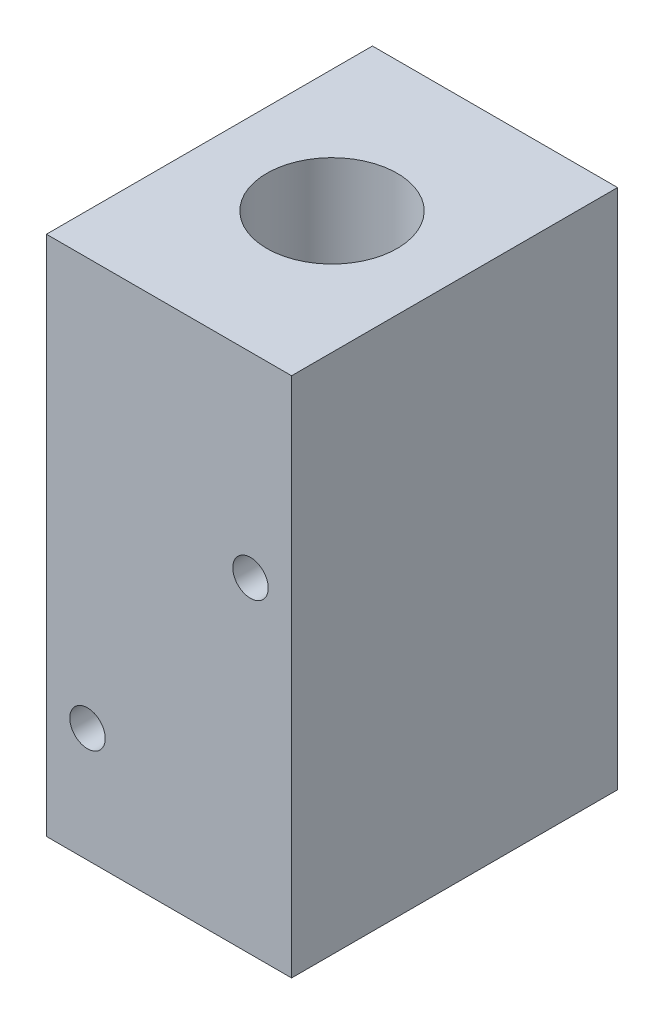
ISO-10303-21;
HEADER;
FILE_DESCRIPTION(('STEP AP214'),'2;1');
FILE_NAME('part.step','',(''),(''),'','','');
FILE_SCHEMA(('AUTOMOTIVE_DESIGN { 1 0 10303 214 1 1 1 1 }'));
ENDSEC;
DATA;
#1=APPLICATION_CONTEXT('core data for automotive mechanical design processes');
#2=APPLICATION_PROTOCOL_DEFINITION('international standard','automotive_design',2000,#1);
#3=PRODUCT_CONTEXT('',#1,'mechanical');
#4=PRODUCT('Part','Part','',(#3));
#5=PRODUCT_RELATED_PRODUCT_CATEGORY('part','',(#4));
#6=PRODUCT_DEFINITION_FORMATION('','',#4);
#7=PRODUCT_DEFINITION_CONTEXT('part definition',#1,'design');
#8=PRODUCT_DEFINITION('design','',#6,#7);
#9=PRODUCT_DEFINITION_SHAPE('','',#8);
#10=(LENGTH_UNIT() NAMED_UNIT(*) SI_UNIT(.MILLI.,.METRE.));
#11=(NAMED_UNIT(*) PLANE_ANGLE_UNIT() SI_UNIT($,.RADIAN.));
#12=(NAMED_UNIT(*) SI_UNIT($,.STERADIAN.) SOLID_ANGLE_UNIT());
#13=UNCERTAINTY_MEASURE_WITH_UNIT(LENGTH_MEASURE(1.E-05),#10,'distance_accuracy_value','');
#14=(GEOMETRIC_REPRESENTATION_CONTEXT(3) GLOBAL_UNCERTAINTY_ASSIGNED_CONTEXT((#13)) GLOBAL_UNIT_ASSIGNED_CONTEXT((#10,
#11,#12)) REPRESENTATION_CONTEXT('',''));
#15=CARTESIAN_POINT('',(0.,0.,0.));
#16=DIRECTION('',(0.,0.,1.));
#17=DIRECTION('',(1.,0.,0.));
#18=AXIS2_PLACEMENT_3D('',#15,#16,#17);
#19=CARTESIAN_POINT('',(-11.938,-50.8,-15.875));
#20=DIRECTION('',(0.,0.,-1.));
#21=DIRECTION('',(0.,1.,0.));
#22=AXIS2_PLACEMENT_3D('',#19,#20,#21);
#23=PLANE('',#22);
#24=DIRECTION('',(1.,0.,0.));
#25=VECTOR('',#24,1.);
#26=CARTESIAN_POINT('',(-11.938,0.,-15.875));
#27=LINE('',#26,#25);
#28=CARTESIAN_POINT('',(-11.938,0.,-15.875));
#29=VERTEX_POINT('',#28);
#30=CARTESIAN_POINT('',(11.938,0.,-15.875));
#31=VERTEX_POINT('',#30);
#32=EDGE_CURVE('E85',#29,#31,#27,.T.);
#33=ORIENTED_EDGE('',*,*,#32,.T.);
#34=DIRECTION('',(0.,1.,0.));
#35=VECTOR('',#34,1.);
#36=CARTESIAN_POINT('',(11.938,-50.8,-15.875));
#37=LINE('',#36,#35);
#38=CARTESIAN_POINT('',(11.938,-50.8,-15.875));
#39=VERTEX_POINT('',#38);
#40=EDGE_CURVE('E88',#39,#31,#37,.T.);
#41=ORIENTED_EDGE('',*,*,#40,.F.);
#42=DIRECTION('',(1.,0.,0.));
#43=VECTOR('',#42,1.);
#44=CARTESIAN_POINT('',(-11.938,-50.8,-15.875));
#45=LINE('',#44,#43);
#46=CARTESIAN_POINT('',(-11.938,-50.8,-15.875));
#47=VERTEX_POINT('',#46);
#48=EDGE_CURVE('E11',#47,#39,#45,.T.);
#49=ORIENTED_EDGE('',*,*,#48,.F.);
#50=DIRECTION('',(0.,1.,0.));
#51=VECTOR('',#50,1.);
#52=CARTESIAN_POINT('',(-11.938,-50.8,-15.875));
#53=LINE('',#52,#51);
#54=EDGE_CURVE('E90',#47,#29,#53,.T.);
#55=ORIENTED_EDGE('',*,*,#54,.T.);
#56=EDGE_LOOP('',(#33,#41,#49,#55));
#57=FACE_BOUND('',#56,.T.);
#58=ADVANCED_FACE('F47',(#57),#23,.T.);
#59=CARTESIAN_POINT('',(-11.938,-50.8,-15.875));
#60=DIRECTION('',(0.,1.,0.));
#61=DIRECTION('',(0.,0.,1.));
#62=AXIS2_PLACEMENT_3D('',#59,#60,#61);
#63=PLANE('',#62);
#64=ORIENTED_EDGE('',*,*,#48,.T.);
#65=DIRECTION('',(0.,0.,1.));
#66=VECTOR('',#65,1.);
#67=CARTESIAN_POINT('',(11.938,-50.8,-15.875));
#68=LINE('',#67,#66);
#69=CARTESIAN_POINT('',(11.938,-50.8,15.875));
#70=VERTEX_POINT('',#69);
#71=EDGE_CURVE('E107',#39,#70,#68,.T.);
#72=ORIENTED_EDGE('',*,*,#71,.T.);
#73=DIRECTION('',(1.,0.,0.));
#74=VECTOR('',#73,1.);
#75=CARTESIAN_POINT('',(-11.938,-50.8,15.875));
#76=LINE('',#75,#74);
#77=CARTESIAN_POINT('',(-11.938,-50.8,15.875));
#78=VERTEX_POINT('',#77);
#79=EDGE_CURVE('E55',#78,#70,#76,.T.);
#80=ORIENTED_EDGE('',*,*,#79,.F.);
#81=DIRECTION('',(0.,0.,1.));
#82=VECTOR('',#81,1.);
#83=CARTESIAN_POINT('',(-11.938,-50.8,-15.875));
#84=LINE('',#83,#82);
#85=EDGE_CURVE('E68',#47,#78,#84,.T.);
#86=ORIENTED_EDGE('',*,*,#85,.F.);
#87=EDGE_LOOP('',(#64,#72,#80,#86));
#88=FACE_BOUND('',#87,.T.);
#89=ADVANCED_FACE('F157',(#88),#63,.F.);
#90=CARTESIAN_POINT('',(-11.938,-50.8,15.875));
#91=DIRECTION('',(0.,0.,-1.));
#92=DIRECTION('',(0.,1.,0.));
#93=AXIS2_PLACEMENT_3D('',#90,#91,#92);
#94=PLANE('',#93);
#95=CARTESIAN_POINT('',(7.9375,-19.05,15.875));
#96=DIRECTION('',(0.,0.,-1.));
#97=DIRECTION('',(0.,1.,0.));
#98=AXIS2_PLACEMENT_3D('',#95,#96,#97);
#99=CIRCLE('',#98,1.7272);
#100=CARTESIAN_POINT('',(6.2103,-19.05,15.875));
#101=VERTEX_POINT('',#100);
#102=EDGE_CURVE('E50',#101,#101,#99,.F.);
#103=ORIENTED_EDGE('',*,*,#102,.F.);
#104=EDGE_LOOP('',(#103));
#105=FACE_BOUND('',#104,.T.);
#106=CARTESIAN_POINT('',(-7.9375,-39.6748,15.875));
#107=DIRECTION('',(0.,0.,-1.));
#108=DIRECTION('',(0.,1.,0.));
#109=AXIS2_PLACEMENT_3D('',#106,#107,#108);
#110=CIRCLE('',#109,1.7272);
#111=CARTESIAN_POINT('',(-9.6647,-39.6748,15.875));
#112=VERTEX_POINT('',#111);
#113=EDGE_CURVE('E110',#112,#112,#110,.F.);
#114=ORIENTED_EDGE('',*,*,#113,.F.);
#115=EDGE_LOOP('',(#114));
#116=FACE_BOUND('',#115,.T.);
#117=ORIENTED_EDGE('',*,*,#79,.T.);
#118=DIRECTION('',(0.,1.,0.));
#119=VECTOR('',#118,1.);
#120=CARTESIAN_POINT('',(11.938,-50.8,15.875));
#121=LINE('',#120,#119);
#122=CARTESIAN_POINT('',(11.938,0.,15.875));
#123=VERTEX_POINT('',#122);
#124=EDGE_CURVE('E103',#70,#123,#121,.T.);
#125=ORIENTED_EDGE('',*,*,#124,.T.);
#126=DIRECTION('',(1.,0.,0.));
#127=VECTOR('',#126,1.);
#128=CARTESIAN_POINT('',(-11.938,0.,15.875));
#129=LINE('',#128,#127);
#130=CARTESIAN_POINT('',(-11.938,0.,15.875));
#131=VERTEX_POINT('',#130);
#132=EDGE_CURVE('E94',#131,#123,#129,.T.);
#133=ORIENTED_EDGE('',*,*,#132,.F.);
#134=DIRECTION('',(0.,1.,0.));
#135=VECTOR('',#134,1.);
#136=CARTESIAN_POINT('',(-11.938,-50.8,15.875));
#137=LINE('',#136,#135);
#138=EDGE_CURVE('E120',#78,#131,#137,.T.);
#139=ORIENTED_EDGE('',*,*,#138,.F.);
#140=EDGE_LOOP('',(#117,#125,#133,#139));
#141=FACE_BOUND('',#140,.T.);
#142=ADVANCED_FACE('F151',(#105,#116,#141),#94,.F.);
#143=CARTESIAN_POINT('',(-11.938,0.,-15.875));
#144=DIRECTION('',(0.,1.,0.));
#145=DIRECTION('',(0.,0.,1.));
#146=AXIS2_PLACEMENT_3D('',#143,#144,#145);
#147=PLANE('',#146);
#148=CARTESIAN_POINT('',(0.,0.,0.));
#149=DIRECTION('',(0.,1.,0.));
#150=DIRECTION('',(0.,0.,1.));
#151=AXIS2_PLACEMENT_3D('',#148,#149,#150);
#152=CIRCLE('',#151,6.35);
#153=CARTESIAN_POINT('',(0.,0.,6.35));
#154=VERTEX_POINT('',#153);
#155=EDGE_CURVE('E134',#154,#154,#152,.T.);
#156=ORIENTED_EDGE('',*,*,#155,.F.);
#157=EDGE_LOOP('',(#156));
#158=FACE_BOUND('',#157,.T.);
#159=ORIENTED_EDGE('',*,*,#132,.T.);
#160=DIRECTION('',(0.,0.,1.));
#161=VECTOR('',#160,1.);
#162=CARTESIAN_POINT('',(11.938,0.,-15.875));
#163=LINE('',#162,#161);
#164=EDGE_CURVE('E97',#31,#123,#163,.T.);
#165=ORIENTED_EDGE('',*,*,#164,.F.);
#166=ORIENTED_EDGE('',*,*,#32,.F.);
#167=DIRECTION('',(0.,0.,1.));
#168=VECTOR('',#167,1.);
#169=CARTESIAN_POINT('',(-11.938,0.,-15.875));
#170=LINE('',#169,#168);
#171=EDGE_CURVE('E118',#29,#131,#170,.T.);
#172=ORIENTED_EDGE('',*,*,#171,.T.);
#173=EDGE_LOOP('',(#159,#165,#166,#172));
#174=FACE_BOUND('',#173,.T.);
#175=ADVANCED_FACE('F98',(#158,#174),#147,.T.);
#176=CARTESIAN_POINT('',(-11.938,0.,0.));
#177=DIRECTION('',(1.,0.,0.));
#178=DIRECTION('',(0.,0.,-1.));
#179=AXIS2_PLACEMENT_3D('',#176,#177,#178);
#180=PLANE('',#179);
#181=ORIENTED_EDGE('',*,*,#54,.F.);
#182=ORIENTED_EDGE('',*,*,#85,.T.);
#183=ORIENTED_EDGE('',*,*,#138,.T.);
#184=ORIENTED_EDGE('',*,*,#171,.F.);
#185=EDGE_LOOP('',(#181,#182,#183,#184));
#186=FACE_BOUND('',#185,.T.);
#187=ADVANCED_FACE('F150',(#186),#180,.F.);
#188=CARTESIAN_POINT('',(11.938,0.,0.));
#189=DIRECTION('',(1.,0.,0.));
#190=DIRECTION('',(0.,0.,-1.));
#191=AXIS2_PLACEMENT_3D('',#188,#189,#190);
#192=PLANE('',#191);
#193=ORIENTED_EDGE('',*,*,#40,.T.);
#194=ORIENTED_EDGE('',*,*,#164,.T.);
#195=ORIENTED_EDGE('',*,*,#124,.F.);
#196=ORIENTED_EDGE('',*,*,#71,.F.);
#197=EDGE_LOOP('',(#193,#194,#195,#196));
#198=FACE_BOUND('',#197,.T.);
#199=ADVANCED_FACE('F105',(#198),#192,.T.);
#200=CARTESIAN_POINT('',(-7.9375,-39.6748,15.875012));
#201=DIRECTION('',(0.,0.,-1.));
#202=DIRECTION('',(-1.,0.,0.));
#203=AXIS2_PLACEMENT_3D('',#200,#201,#202);
#204=CYLINDRICAL_SURFACE('',#203,1.7272);
#205=CARTESIAN_POINT('',(-7.9375,-39.6748,12.7));
#206=DIRECTION('',(0.,0.,1.));
#207=DIRECTION('',(1.,0.,0.));
#208=AXIS2_PLACEMENT_3D('',#205,#206,#207);
#209=CIRCLE('',#208,1.7272);
#210=CARTESIAN_POINT('',(-9.6647,-39.6748,12.7));
#211=VERTEX_POINT('',#210);
#212=EDGE_CURVE('E112',#211,#211,#209,.T.);
#213=CARTESIAN_POINT('',(-9.6647,-39.6748,12.7));
#214=CARTESIAN_POINT('',(-9.6647,-39.6748,12.7330729166667));
#215=CARTESIAN_POINT('',(-9.6647,-39.6748,12.7661458333333));
#216=CARTESIAN_POINT('',(-9.6647,-39.6748,12.8322916666667));
#217=CARTESIAN_POINT('',(-9.6647,-39.6748,12.8653645833333));
#218=CARTESIAN_POINT('',(-9.6647,-39.6748,12.9315104166667));
#219=CARTESIAN_POINT('',(-9.6647,-39.6748,12.9645833333333));
#220=CARTESIAN_POINT('',(-9.6647,-39.6748,13.0307291666667));
#221=CARTESIAN_POINT('',(-9.6647,-39.6748,13.0638020833333));
#222=CARTESIAN_POINT('',(-9.6647,-39.6748,13.1299479166667));
#223=CARTESIAN_POINT('',(-9.6647,-39.6748,13.1630208333333));
#224=CARTESIAN_POINT('',(-9.6647,-39.6748,13.2291666666667));
#225=CARTESIAN_POINT('',(-9.6647,-39.6748,13.2622395833333));
#226=CARTESIAN_POINT('',(-9.6647,-39.6748,13.3283854166667));
#227=CARTESIAN_POINT('',(-9.6647,-39.6748,13.3614583333333));
#228=CARTESIAN_POINT('',(-9.6647,-39.6748,13.4276041666667));
#229=CARTESIAN_POINT('',(-9.6647,-39.6748,13.4606770833333));
#230=CARTESIAN_POINT('',(-9.6647,-39.6748,13.5268229166667));
#231=CARTESIAN_POINT('',(-9.6647,-39.6748,13.5598958333333));
#232=CARTESIAN_POINT('',(-9.6647,-39.6748,13.6260416666667));
#233=CARTESIAN_POINT('',(-9.6647,-39.6748,13.6591145833333));
#234=CARTESIAN_POINT('',(-9.6647,-39.6748,13.7252604166667));
#235=CARTESIAN_POINT('',(-9.6647,-39.6748,13.7583333333333));
#236=CARTESIAN_POINT('',(-9.6647,-39.6748,13.8244791666667));
#237=CARTESIAN_POINT('',(-9.6647,-39.6748,13.8575520833333));
#238=CARTESIAN_POINT('',(-9.6647,-39.6748,13.9236979166667));
#239=CARTESIAN_POINT('',(-9.6647,-39.6748,13.9567708333333));
#240=CARTESIAN_POINT('',(-9.6647,-39.6748,14.0229166666667));
#241=CARTESIAN_POINT('',(-9.6647,-39.6748,14.0559895833333));
#242=CARTESIAN_POINT('',(-9.6647,-39.6748,14.1221354166667));
#243=CARTESIAN_POINT('',(-9.6647,-39.6748,14.1552083333333));
#244=CARTESIAN_POINT('',(-9.6647,-39.6748,14.2213541666667));
#245=CARTESIAN_POINT('',(-9.6647,-39.6748,14.2544270833333));
#246=CARTESIAN_POINT('',(-9.6647,-39.6748,14.3205729166667));
#247=CARTESIAN_POINT('',(-9.6647,-39.6748,14.3536458333333));
#248=CARTESIAN_POINT('',(-9.6647,-39.6748,14.4197916666667));
#249=CARTESIAN_POINT('',(-9.6647,-39.6748,14.4528645833333));
#250=CARTESIAN_POINT('',(-9.6647,-39.6748,14.5190104166667));
#251=CARTESIAN_POINT('',(-9.6647,-39.6748,14.5520833333333));
#252=CARTESIAN_POINT('',(-9.6647,-39.6748,14.6182291666667));
#253=CARTESIAN_POINT('',(-9.6647,-39.6748,14.6513020833333));
#254=CARTESIAN_POINT('',(-9.6647,-39.6748,14.7174479166667));
#255=CARTESIAN_POINT('',(-9.6647,-39.6748,14.7505208333333));
#256=CARTESIAN_POINT('',(-9.6647,-39.6748,14.8166666666667));
#257=CARTESIAN_POINT('',(-9.6647,-39.6748,14.8497395833333));
#258=CARTESIAN_POINT('',(-9.6647,-39.6748,14.9158854166667));
#259=CARTESIAN_POINT('',(-9.6647,-39.6748,14.9489583333333));
#260=CARTESIAN_POINT('',(-9.6647,-39.6748,15.0151041666667));
#261=CARTESIAN_POINT('',(-9.6647,-39.6748,15.0481770833333));
#262=CARTESIAN_POINT('',(-9.6647,-39.6748,15.1143229166667));
#263=CARTESIAN_POINT('',(-9.6647,-39.6748,15.1473958333333));
#264=CARTESIAN_POINT('',(-9.6647,-39.6748,15.2135416666667));
#265=CARTESIAN_POINT('',(-9.6647,-39.6748,15.2466145833333));
#266=CARTESIAN_POINT('',(-9.6647,-39.6748,15.3127604166667));
#267=CARTESIAN_POINT('',(-9.6647,-39.6748,15.3458333333333));
#268=CARTESIAN_POINT('',(-9.6647,-39.6748,15.4119791666667));
#269=CARTESIAN_POINT('',(-9.6647,-39.6748,15.4450520833333));
#270=CARTESIAN_POINT('',(-9.6647,-39.6748,15.5111979166667));
#271=CARTESIAN_POINT('',(-9.6647,-39.6748,15.5442708333333));
#272=CARTESIAN_POINT('',(-9.6647,-39.6748,15.6104166666667));
#273=CARTESIAN_POINT('',(-9.6647,-39.6748,15.6434895833333));
#274=CARTESIAN_POINT('',(-9.6647,-39.6748,15.7096354166667));
#275=CARTESIAN_POINT('',(-9.6647,-39.6748,15.7427083333333));
#276=CARTESIAN_POINT('',(-9.6647,-39.6748,15.8088541666667));
#277=CARTESIAN_POINT('',(-9.6647,-39.6748,15.8419270833333));
#278=CARTESIAN_POINT('',(-9.6647,-39.6748,15.875));
#279=B_SPLINE_CURVE_WITH_KNOTS('',3,(#213,#214,#215,#216,#217,#218,#219,#220,#221,#222,#223,
#224,#225,#226,#227,#228,#229,#230,#231,#232,#233,#234,#235,#236,#237,#238,#239,#240,#241,#242,
#243,#244,#245,#246,#247,#248,#249,#250,#251,#252,#253,#254,#255,#256,#257,#258,#259,#260,#261,
#262,#263,#264,#265,#266,#267,#268,#269,#270,#271,#272,#273,#274,#275,#276,#277,#278),
.UNSPECIFIED.,.F.,.F.,(4,2,2,2,2,2,2,2,2,2,2,2,2,2,2,2,2,2,2,2,2,2,2,2,2,2,2,2,2,2,2,2,4),(0.,
0.0992187500000012,0.198437500000001,0.297656250000002,0.396875000000001,0.496093750000003,
0.595312500000002,0.694531250000003,0.793750000000003,0.892968750000004,0.992187500000003,
1.09140625,1.190625,1.28984375000001,1.3890625,1.48828125000001,1.58750000000001,
1.68671875000001,1.78593750000001,1.88515625000001,1.98437500000001,2.08359375000001,
2.18281250000001,2.28203125000001,2.38125000000001,2.48046875000001,2.57968750000001,
2.67890625000001,2.77812500000001,2.87734375000001,2.97656250000001,3.07578125000001,
3.17500000000001),.UNSPECIFIED.);
#280=EDGE_CURVE('BSEAM171',#211,#112,#279,.T.);
#281=ORIENTED_EDGE('',*,*,#212,.F.);
#282=ORIENTED_EDGE('',*,*,#113,.T.);
#283=ORIENTED_EDGE('',*,*,#280,.T.);
#284=ORIENTED_EDGE('',*,*,#280,.F.);
#285=EDGE_LOOP('',(#281,#283,#282,#284));
#286=FACE_BOUND('',#285,.T.);
#287=ADVANCED_FACE('F171',(#286),#204,.F.);
#288=CARTESIAN_POINT('',(-7.9375,-39.6748,12.7));
#289=DIRECTION('',(0.,0.,1.));
#290=DIRECTION('',(1.,0.,0.));
#291=AXIS2_PLACEMENT_3D('',#288,#289,#290);
#292=PLANE('',#291);
#293=ORIENTED_EDGE('',*,*,#212,.T.);
#294=EDGE_LOOP('',(#293));
#295=FACE_BOUND('',#294,.T.);
#296=ADVANCED_FACE('F172',(#295),#292,.T.);
#297=CARTESIAN_POINT('',(7.9375,-19.05,15.875012));
#298=DIRECTION('',(0.,0.,-1.));
#299=DIRECTION('',(-1.,0.,0.));
#300=AXIS2_PLACEMENT_3D('',#297,#298,#299);
#301=CYLINDRICAL_SURFACE('',#300,1.7272);
#302=CARTESIAN_POINT('',(7.9375,-19.05,12.7));
#303=DIRECTION('',(0.,0.,1.));
#304=DIRECTION('',(1.,0.,0.));
#305=AXIS2_PLACEMENT_3D('',#302,#303,#304);
#306=CIRCLE('',#305,1.7272);
#307=CARTESIAN_POINT('',(6.2103,-19.05,12.7));
#308=VERTEX_POINT('',#307);
#309=EDGE_CURVE('E125',#308,#308,#306,.T.);
#310=CARTESIAN_POINT('',(6.2103,-19.05,12.7));
#311=CARTESIAN_POINT('',(6.2103,-19.05,12.7330729166667));
#312=CARTESIAN_POINT('',(6.2103,-19.05,12.7661458333333));
#313=CARTESIAN_POINT('',(6.2103,-19.05,12.8322916666667));
#314=CARTESIAN_POINT('',(6.2103,-19.05,12.8653645833333));
#315=CARTESIAN_POINT('',(6.2103,-19.05,12.9315104166667));
#316=CARTESIAN_POINT('',(6.2103,-19.05,12.9645833333333));
#317=CARTESIAN_POINT('',(6.2103,-19.05,13.0307291666667));
#318=CARTESIAN_POINT('',(6.2103,-19.05,13.0638020833333));
#319=CARTESIAN_POINT('',(6.2103,-19.05,13.1299479166667));
#320=CARTESIAN_POINT('',(6.2103,-19.05,13.1630208333333));
#321=CARTESIAN_POINT('',(6.2103,-19.05,13.2291666666667));
#322=CARTESIAN_POINT('',(6.2103,-19.05,13.2622395833333));
#323=CARTESIAN_POINT('',(6.2103,-19.05,13.3283854166667));
#324=CARTESIAN_POINT('',(6.2103,-19.05,13.3614583333333));
#325=CARTESIAN_POINT('',(6.2103,-19.05,13.4276041666667));
#326=CARTESIAN_POINT('',(6.2103,-19.05,13.4606770833333));
#327=CARTESIAN_POINT('',(6.2103,-19.05,13.5268229166667));
#328=CARTESIAN_POINT('',(6.2103,-19.05,13.5598958333333));
#329=CARTESIAN_POINT('',(6.2103,-19.05,13.6260416666667));
#330=CARTESIAN_POINT('',(6.2103,-19.05,13.6591145833333));
#331=CARTESIAN_POINT('',(6.2103,-19.05,13.7252604166667));
#332=CARTESIAN_POINT('',(6.2103,-19.05,13.7583333333333));
#333=CARTESIAN_POINT('',(6.2103,-19.05,13.8244791666667));
#334=CARTESIAN_POINT('',(6.2103,-19.05,13.8575520833333));
#335=CARTESIAN_POINT('',(6.2103,-19.05,13.9236979166667));
#336=CARTESIAN_POINT('',(6.2103,-19.05,13.9567708333333));
#337=CARTESIAN_POINT('',(6.2103,-19.05,14.0229166666667));
#338=CARTESIAN_POINT('',(6.2103,-19.05,14.0559895833333));
#339=CARTESIAN_POINT('',(6.2103,-19.05,14.1221354166667));
#340=CARTESIAN_POINT('',(6.2103,-19.05,14.1552083333333));
#341=CARTESIAN_POINT('',(6.2103,-19.05,14.2213541666667));
#342=CARTESIAN_POINT('',(6.2103,-19.05,14.2544270833333));
#343=CARTESIAN_POINT('',(6.2103,-19.05,14.3205729166667));
#344=CARTESIAN_POINT('',(6.2103,-19.05,14.3536458333333));
#345=CARTESIAN_POINT('',(6.2103,-19.05,14.4197916666667));
#346=CARTESIAN_POINT('',(6.2103,-19.05,14.4528645833333));
#347=CARTESIAN_POINT('',(6.2103,-19.05,14.5190104166667));
#348=CARTESIAN_POINT('',(6.2103,-19.05,14.5520833333333));
#349=CARTESIAN_POINT('',(6.2103,-19.05,14.6182291666667));
#350=CARTESIAN_POINT('',(6.2103,-19.05,14.6513020833333));
#351=CARTESIAN_POINT('',(6.2103,-19.05,14.7174479166667));
#352=CARTESIAN_POINT('',(6.2103,-19.05,14.7505208333333));
#353=CARTESIAN_POINT('',(6.2103,-19.05,14.8166666666667));
#354=CARTESIAN_POINT('',(6.2103,-19.05,14.8497395833333));
#355=CARTESIAN_POINT('',(6.2103,-19.05,14.9158854166667));
#356=CARTESIAN_POINT('',(6.2103,-19.05,14.9489583333333));
#357=CARTESIAN_POINT('',(6.2103,-19.05,15.0151041666667));
#358=CARTESIAN_POINT('',(6.2103,-19.05,15.0481770833333));
#359=CARTESIAN_POINT('',(6.2103,-19.05,15.1143229166667));
#360=CARTESIAN_POINT('',(6.2103,-19.05,15.1473958333333));
#361=CARTESIAN_POINT('',(6.2103,-19.05,15.2135416666667));
#362=CARTESIAN_POINT('',(6.2103,-19.05,15.2466145833333));
#363=CARTESIAN_POINT('',(6.2103,-19.05,15.3127604166667));
#364=CARTESIAN_POINT('',(6.2103,-19.05,15.3458333333333));
#365=CARTESIAN_POINT('',(6.2103,-19.05,15.4119791666667));
#366=CARTESIAN_POINT('',(6.2103,-19.05,15.4450520833333));
#367=CARTESIAN_POINT('',(6.2103,-19.05,15.5111979166667));
#368=CARTESIAN_POINT('',(6.2103,-19.05,15.5442708333333));
#369=CARTESIAN_POINT('',(6.2103,-19.05,15.6104166666667));
#370=CARTESIAN_POINT('',(6.2103,-19.05,15.6434895833333));
#371=CARTESIAN_POINT('',(6.2103,-19.05,15.7096354166667));
#372=CARTESIAN_POINT('',(6.2103,-19.05,15.7427083333333));
#373=CARTESIAN_POINT('',(6.2103,-19.05,15.8088541666667));
#374=CARTESIAN_POINT('',(6.2103,-19.05,15.8419270833333));
#375=CARTESIAN_POINT('',(6.2103,-19.05,15.875));
#376=B_SPLINE_CURVE_WITH_KNOTS('',3,(#310,#311,#312,#313,#314,#315,#316,#317,#318,#319,#320,
#321,#322,#323,#324,#325,#326,#327,#328,#329,#330,#331,#332,#333,#334,#335,#336,#337,#338,#339,
#340,#341,#342,#343,#344,#345,#346,#347,#348,#349,#350,#351,#352,#353,#354,#355,#356,#357,#358,
#359,#360,#361,#362,#363,#364,#365,#366,#367,#368,#369,#370,#371,#372,#373,#374,#375),
.UNSPECIFIED.,.F.,.F.,(4,2,2,2,2,2,2,2,2,2,2,2,2,2,2,2,2,2,2,2,2,2,2,2,2,2,2,2,2,2,2,2,4),(0.,
0.0992187500000012,0.198437500000001,0.297656250000002,0.396875000000001,0.496093750000001,
0.595312500000002,0.694531250000002,0.793750000000003,0.892968750000002,0.992187500000003,
1.09140625,1.190625,1.28984375,1.3890625,1.48828125,1.5875,1.68671875000001,1.7859375,
1.88515625,1.98437500000001,2.08359375,2.18281250000001,2.28203125000001,2.38125000000001,
2.48046875000001,2.57968750000001,2.67890625000001,2.77812500000001,2.87734375000001,
2.97656250000001,3.07578125000001,3.17500000000001),.UNSPECIFIED.);
#377=EDGE_CURVE('BSEAM175',#308,#101,#376,.T.);
#378=ORIENTED_EDGE('',*,*,#309,.F.);
#379=ORIENTED_EDGE('',*,*,#102,.T.);
#380=ORIENTED_EDGE('',*,*,#377,.T.);
#381=ORIENTED_EDGE('',*,*,#377,.F.);
#382=EDGE_LOOP('',(#378,#380,#379,#381));
#383=FACE_BOUND('',#382,.T.);
#384=ADVANCED_FACE('F175',(#383),#301,.F.);
#385=CARTESIAN_POINT('',(7.9375,-19.05,12.7));
#386=DIRECTION('',(0.,0.,1.));
#387=DIRECTION('',(1.,0.,0.));
#388=AXIS2_PLACEMENT_3D('',#385,#386,#387);
#389=PLANE('',#388);
#390=ORIENTED_EDGE('',*,*,#309,.T.);
#391=EDGE_LOOP('',(#390));
#392=FACE_BOUND('',#391,.T.);
#393=ADVANCED_FACE('F145',(#392),#389,.T.);
#394=CARTESIAN_POINT('',(0.,-38.1,0.));
#395=DIRECTION('',(0.,1.,0.));
#396=DIRECTION('',(0.,0.,1.));
#397=AXIS2_PLACEMENT_3D('',#394,#395,#396);
#398=CYLINDRICAL_SURFACE('',#397,6.35);
#399=CARTESIAN_POINT('',(0.,-38.1,0.));
#400=DIRECTION('',(0.,1.,0.));
#401=DIRECTION('',(0.,0.,1.));
#402=AXIS2_PLACEMENT_3D('',#399,#400,#401);
#403=CIRCLE('',#402,6.35);
#404=CARTESIAN_POINT('',(0.,-38.1,6.35));
#405=VERTEX_POINT('',#404);
#406=EDGE_CURVE('E132',#405,#405,#403,.T.);
#407=CARTESIAN_POINT('',(0.,-38.1,6.35));
#408=CARTESIAN_POINT('',(0.,-37.703125,6.35));
#409=CARTESIAN_POINT('',(0.,-37.30625,6.35));
#410=CARTESIAN_POINT('',(0.,-36.5125,6.35));
#411=CARTESIAN_POINT('',(0.,-36.115625,6.35));
#412=CARTESIAN_POINT('',(0.,-35.321875,6.35));
#413=CARTESIAN_POINT('',(0.,-34.925,6.35));
#414=CARTESIAN_POINT('',(0.,-34.13125,6.35));
#415=CARTESIAN_POINT('',(0.,-33.734375,6.35));
#416=CARTESIAN_POINT('',(0.,-32.940625,6.35));
#417=CARTESIAN_POINT('',(0.,-32.54375,6.35));
#418=CARTESIAN_POINT('',(0.,-31.75,6.35));
#419=CARTESIAN_POINT('',(0.,-31.353125,6.35));
#420=CARTESIAN_POINT('',(0.,-30.559375,6.35));
#421=CARTESIAN_POINT('',(0.,-30.1625,6.35));
#422=CARTESIAN_POINT('',(0.,-29.36875,6.35));
#423=CARTESIAN_POINT('',(0.,-28.971875,6.35));
#424=CARTESIAN_POINT('',(0.,-28.178125,6.35));
#425=CARTESIAN_POINT('',(0.,-27.78125,6.35));
#426=CARTESIAN_POINT('',(0.,-26.9875,6.35));
#427=CARTESIAN_POINT('',(0.,-26.590625,6.35));
#428=CARTESIAN_POINT('',(0.,-25.796875,6.35));
#429=CARTESIAN_POINT('',(0.,-25.4,6.35));
#430=CARTESIAN_POINT('',(0.,-24.60625,6.35));
#431=CARTESIAN_POINT('',(0.,-24.209375,6.35));
#432=CARTESIAN_POINT('',(0.,-23.415625,6.35));
#433=CARTESIAN_POINT('',(0.,-23.01875,6.35));
#434=CARTESIAN_POINT('',(0.,-22.225,6.35));
#435=CARTESIAN_POINT('',(0.,-21.828125,6.35));
#436=CARTESIAN_POINT('',(0.,-21.034375,6.35));
#437=CARTESIAN_POINT('',(0.,-20.6375,6.35));
#438=CARTESIAN_POINT('',(0.,-19.84375,6.35));
#439=CARTESIAN_POINT('',(0.,-19.446875,6.35));
#440=CARTESIAN_POINT('',(0.,-18.653125,6.35));
#441=CARTESIAN_POINT('',(0.,-18.25625,6.35));
#442=CARTESIAN_POINT('',(0.,-17.4625,6.35));
#443=CARTESIAN_POINT('',(0.,-17.065625,6.35));
#444=CARTESIAN_POINT('',(0.,-16.271875,6.35));
#445=CARTESIAN_POINT('',(0.,-15.875,6.35));
#446=CARTESIAN_POINT('',(0.,-15.08125,6.35));
#447=CARTESIAN_POINT('',(0.,-14.684375,6.35));
#448=CARTESIAN_POINT('',(0.,-13.890625,6.35));
#449=CARTESIAN_POINT('',(0.,-13.49375,6.35));
#450=CARTESIAN_POINT('',(0.,-12.7,6.35));
#451=CARTESIAN_POINT('',(0.,-12.303125,6.35));
#452=CARTESIAN_POINT('',(0.,-11.509375,6.35));
#453=CARTESIAN_POINT('',(0.,-11.1125,6.35));
#454=CARTESIAN_POINT('',(0.,-10.31875,6.35));
#455=CARTESIAN_POINT('',(0.,-9.921875,6.35));
#456=CARTESIAN_POINT('',(0.,-9.128125,6.35));
#457=CARTESIAN_POINT('',(0.,-8.73125,6.35));
#458=CARTESIAN_POINT('',(0.,-7.9375,6.35));
#459=CARTESIAN_POINT('',(0.,-7.540625,6.35));
#460=CARTESIAN_POINT('',(0.,-6.746875,6.35));
#461=CARTESIAN_POINT('',(0.,-6.35,6.35));
#462=CARTESIAN_POINT('',(0.,-5.55625,6.35));
#463=CARTESIAN_POINT('',(0.,-5.159375,6.35));
#464=CARTESIAN_POINT('',(0.,-4.365625,6.35));
#465=CARTESIAN_POINT('',(0.,-3.96875,6.35));
#466=CARTESIAN_POINT('',(0.,-3.175,6.35));
#467=CARTESIAN_POINT('',(0.,-2.778125,6.35));
#468=CARTESIAN_POINT('',(0.,-1.984375,6.35));
#469=CARTESIAN_POINT('',(0.,-1.5875,6.35));
#470=CARTESIAN_POINT('',(0.,-0.79375,6.35));
#471=CARTESIAN_POINT('',(0.,-0.396875,6.35));
#472=CARTESIAN_POINT('',(0.,0.,6.35));
#473=B_SPLINE_CURVE_WITH_KNOTS('',3,(#407,#408,#409,#410,#411,#412,#413,#414,#415,#416,#417,
#418,#419,#420,#421,#422,#423,#424,#425,#426,#427,#428,#429,#430,#431,#432,#433,#434,#435,#436,
#437,#438,#439,#440,#441,#442,#443,#444,#445,#446,#447,#448,#449,#450,#451,#452,#453,#454,#455,
#456,#457,#458,#459,#460,#461,#462,#463,#464,#465,#466,#467,#468,#469,#470,#471,#472),
.UNSPECIFIED.,.F.,.F.,(4,2,2,2,2,2,2,2,2,2,2,2,2,2,2,2,2,2,2,2,2,2,2,2,2,2,2,2,2,2,2,2,4),(0.,
1.190625,2.38125,3.571875,4.7625,5.953125,7.14375,8.334375,9.52500000000001,10.715625,11.90625,
13.096875,14.2875,15.478125,16.66875,17.859375,19.05,20.240625,21.43125,22.621875,23.8125,
25.003125,26.19375,27.384375,28.575,29.765625,30.95625,32.146875,33.3375,34.528125,35.71875,
36.909375,38.1),.UNSPECIFIED.);
#474=EDGE_CURVE('BSEAM142',#405,#154,#473,.T.);
#475=ORIENTED_EDGE('',*,*,#406,.F.);
#476=ORIENTED_EDGE('',*,*,#155,.T.);
#477=ORIENTED_EDGE('',*,*,#474,.T.);
#478=ORIENTED_EDGE('',*,*,#474,.F.);
#479=EDGE_LOOP('',(#475,#477,#476,#478));
#480=FACE_BOUND('',#479,.T.);
#481=ADVANCED_FACE('F142',(#480),#398,.F.);
#482=CARTESIAN_POINT('',(0.,-38.1,0.));
#483=DIRECTION('',(0.,1.,0.));
#484=DIRECTION('',(0.,0.,1.));
#485=AXIS2_PLACEMENT_3D('',#482,#483,#484);
#486=PLANE('',#485);
#487=ORIENTED_EDGE('',*,*,#406,.T.);
#488=EDGE_LOOP('',(#487));
#489=FACE_BOUND('',#488,.T.);
#490=ADVANCED_FACE('F140',(#489),#486,.T.);
#491=CLOSED_SHELL('',(#58,#89,#142,#175,#187,#199,#287,#296,#384,#393,#481,#490));
#492=MANIFOLD_SOLID_BREP('B2',#491);
#493=ADVANCED_BREP_SHAPE_REPRESENTATION('',(#18,#492),#14);
#494=SHAPE_DEFINITION_REPRESENTATION(#9,#493);
ENDSEC;
END-ISO-10303-21;
